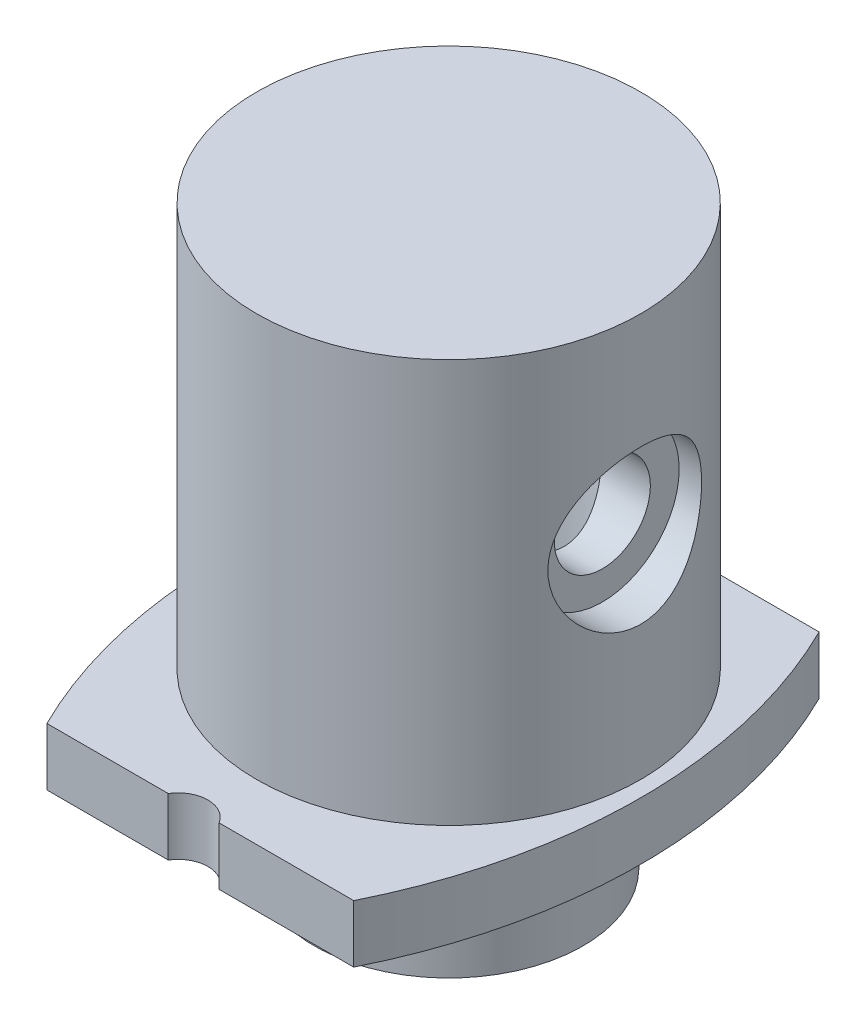
ISO-10303-21;
HEADER;
FILE_DESCRIPTION(('STEP AP214'),'2;1');
FILE_NAME('part.step','',(''),(''),'','','');
FILE_SCHEMA(('AUTOMOTIVE_DESIGN { 1 0 10303 214 1 1 1 1 }'));
ENDSEC;
DATA;
#1=APPLICATION_CONTEXT('core data for automotive mechanical design processes');
#2=APPLICATION_PROTOCOL_DEFINITION('international standard','automotive_design',2000,#1);
#3=PRODUCT_CONTEXT('',#1,'mechanical');
#4=PRODUCT('Part','Part','',(#3));
#5=PRODUCT_RELATED_PRODUCT_CATEGORY('part','',(#4));
#6=PRODUCT_DEFINITION_FORMATION('','',#4);
#7=PRODUCT_DEFINITION_CONTEXT('part definition',#1,'design');
#8=PRODUCT_DEFINITION('design','',#6,#7);
#9=PRODUCT_DEFINITION_SHAPE('','',#8);
#10=(LENGTH_UNIT() NAMED_UNIT(*) SI_UNIT(.MILLI.,.METRE.));
#11=(NAMED_UNIT(*) PLANE_ANGLE_UNIT() SI_UNIT($,.RADIAN.));
#12=(NAMED_UNIT(*) SI_UNIT($,.STERADIAN.) SOLID_ANGLE_UNIT());
#13=UNCERTAINTY_MEASURE_WITH_UNIT(LENGTH_MEASURE(1.E-05),#10,'distance_accuracy_value','');
#14=(GEOMETRIC_REPRESENTATION_CONTEXT(3) GLOBAL_UNCERTAINTY_ASSIGNED_CONTEXT((#13)) GLOBAL_UNIT_ASSIGNED_CONTEXT((#10,
#11,#12)) REPRESENTATION_CONTEXT('',''));
#15=CARTESIAN_POINT('',(0.,0.,0.));
#16=DIRECTION('',(0.,0.,1.));
#17=DIRECTION('',(1.,0.,0.));
#18=AXIS2_PLACEMENT_3D('',#15,#16,#17);
#19=CARTESIAN_POINT('',(-7.98578744171232,-3.,12.9281560249964));
#20=DIRECTION('',(0.,0.,1.));
#21=DIRECTION('',(1.,0.,0.));
#22=AXIS2_PLACEMENT_3D('',#19,#20,#21);
#23=PLANE('',#22);
#24=DIRECTION('',(0.,1.,0.));
#25=VECTOR('',#24,1.);
#26=CARTESIAN_POINT('',(0.976511748965211,-9.,12.9281560249964));
#27=LINE('',#26,#25);
#28=CARTESIAN_POINT('',(0.976511748965211,-3.,12.9281560249964));
#29=VERTEX_POINT('',#28);
#30=CARTESIAN_POINT('',(0.976511748965211,0.,12.9281560249964));
#31=VERTEX_POINT('',#30);
#32=EDGE_CURVE('E55',#29,#31,#27,.T.);
#33=ORIENTED_EDGE('',*,*,#32,.F.);
#34=DIRECTION('',(1.,0.,0.));
#35=VECTOR('',#34,1.);
#36=CARTESIAN_POINT('',(-7.98578744171232,-3.,12.9281560249964));
#37=LINE('',#36,#35);
#38=CARTESIAN_POINT('',(7.98578744171232,-3.,12.9281560249964));
#39=VERTEX_POINT('',#38);
#40=EDGE_CURVE('E326',#29,#39,#37,.T.);
#41=ORIENTED_EDGE('',*,*,#40,.T.);
#42=DIRECTION('',(0.,1.,0.));
#43=VECTOR('',#42,1.);
#44=CARTESIAN_POINT('',(7.98578744171232,-3.,12.9281560249964));
#45=LINE('',#44,#43);
#46=CARTESIAN_POINT('',(7.98578744171232,0.,12.9281560249964));
#47=VERTEX_POINT('',#46);
#48=EDGE_CURVE('E125',#39,#47,#45,.T.);
#49=ORIENTED_EDGE('',*,*,#48,.T.);
#50=DIRECTION('',(1.,0.,0.));
#51=VECTOR('',#50,1.);
#52=CARTESIAN_POINT('',(-7.98578744171232,0.,12.9281560249964));
#53=LINE('',#52,#51);
#54=EDGE_CURVE('E117',#31,#47,#53,.T.);
#55=ORIENTED_EDGE('',*,*,#54,.F.);
#56=EDGE_LOOP('',(#33,#41,#49,#55));
#57=FACE_BOUND('',#56,.T.);
#58=ADVANCED_FACE('F35',(#57),#23,.T.);
#59=CARTESIAN_POINT('',(0.,21.,0.));
#60=DIRECTION('',(0.,-1.,0.));
#61=DIRECTION('',(0.,0.,-1.));
#62=AXIS2_PLACEMENT_3D('',#59,#60,#61);
#63=CYLINDRICAL_SURFACE('',#62,10.);
#64=CARTESIAN_POINT('',(9.16515138991168,11.,-4.));
#65=CARTESIAN_POINT('',(9.16515220722506,10.8928225032156,-3.99999917996685));
#66=CARTESIAN_POINT('',(9.16703782704588,10.7856121402052,-3.99568627578832));
#67=CARTESIAN_POINT('',(9.17451890581268,10.5719679058293,-3.97847804504315));
#68=CARTESIAN_POINT('',(9.18011663538446,10.4655345500547,-3.965577465543));
#69=CARTESIAN_POINT('',(9.19485078616074,10.2540640466445,-3.9312935770878));
#70=CARTESIAN_POINT('',(9.20399425848326,10.1490301151513,-3.90989336356571));
#71=CARTESIAN_POINT('',(9.2255144619826,9.94131240281023,-3.85883937208579));
#72=CARTESIAN_POINT('',(9.23789253541712,9.83862961689824,-3.82918216740128));
#73=CARTESIAN_POINT('',(9.27920231487636,9.53601027337141,-3.72849978450445));
#74=CARTESIAN_POINT('',(9.31238810193525,9.34046207903567,-3.64559228099563));
#75=CARTESIAN_POINT('',(9.38629512671437,8.96619873132704,-3.45083256453888));
#76=CARTESIAN_POINT('',(9.42701471853534,8.78747991410875,-3.33898667159604));
#77=CARTESIAN_POINT('',(9.51401677460927,8.44148818639859,-3.08264624953203));
#78=CARTESIAN_POINT('',(9.56047821792022,8.27528956671102,-2.93675933272146));
#79=CARTESIAN_POINT('',(9.65224928088018,7.96893959195808,-2.61941759406606));
#80=CARTESIAN_POINT('',(9.69755849326326,7.82879733924504,-2.44795387495429));
#81=CARTESIAN_POINT('',(9.78406811808174,7.5731878901629,-2.07601279575004));
#82=CARTESIAN_POINT('',(9.82503606295846,7.45891158003059,-1.87465797803874));
#83=CARTESIAN_POINT('',(9.89607856333948,7.26631268032305,-1.45365059895514));
#84=CARTESIAN_POINT('',(9.92615755049622,7.18797546056676,-1.23400552632834));
#85=CARTESIAN_POINT('',(9.97076649749865,7.07331707267703,-0.793932865332428));
#86=CARTESIAN_POINT('',(9.98597873479395,7.03514538400194,-0.574057972725523));
#87=CARTESIAN_POINT('',(10.001606214367,6.99594301649917,-0.130532654160157));
#88=CARTESIAN_POINT('',(10.0020269755724,6.99489848495549,0.0931163324631206));
#89=CARTESIAN_POINT('',(9.98843925626005,7.02896554254645,0.524464988663932));
#90=CARTESIAN_POINT('',(9.9752399353889,7.06204954629711,0.732354905542457));
#91=CARTESIAN_POINT('',(9.93698582942363,7.1599857518182,1.1393462186423));
#92=CARTESIAN_POINT('',(9.91193017443785,7.22484028458435,1.33844696883604));
#93=CARTESIAN_POINT('',(9.85193648913816,7.38527296597229,1.72579587696675));
#94=CARTESIAN_POINT('',(9.81685520932146,7.48129942968872,1.91383524674319));
#95=CARTESIAN_POINT('',(9.7402917036085,7.70093001378034,2.27161630149723));
#96=CARTESIAN_POINT('',(9.69880728534381,7.82454358618434,2.44135168543995));
#97=CARTESIAN_POINT('',(9.61043274352157,8.1052982719048,2.76953765597606));
#98=CARTESIAN_POINT('',(9.56336653023493,8.26410778515017,2.92651569053149));
#99=CARTESIAN_POINT('',(9.4712332194655,8.60598114365943,3.21221483078645));
#100=CARTESIAN_POINT('',(9.42616678016159,8.78905289638997,3.34092668757428));
#101=CARTESIAN_POINT('',(9.3419379481804,9.18083804474915,3.56980837743822));
#102=CARTESIAN_POINT('',(9.30297828115414,9.39012966067764,3.66906930327244));
#103=CARTESIAN_POINT('',(9.23775180688171,9.8244309806241,3.83035251973301));
#104=CARTESIAN_POINT('',(9.21147675782622,10.0494303694531,3.89239899675599));
#105=CARTESIAN_POINT('',(9.17659519405432,10.4940715549349,3.97390989770977));
#106=CARTESIAN_POINT('',(9.16700732912276,10.7132008942571,3.99574419362908));
#107=CARTESIAN_POINT('',(9.16378995738077,11.1521544155191,4.00312265288578));
#108=CARTESIAN_POINT('',(9.17015561120724,11.3719783665513,3.98867782118257));
#109=CARTESIAN_POINT('',(9.19712088718227,11.7929178699139,3.92606578958006));
#110=CARTESIAN_POINT('',(9.21688915596603,11.9943858748,3.87986612404771));
#111=CARTESIAN_POINT('',(9.26740102054679,12.386576809571,3.75760837382175));
#112=CARTESIAN_POINT('',(9.29814704977195,12.5772973462148,3.68154366860459));
#113=CARTESIAN_POINT('',(9.36867563720203,12.9512047155908,3.49827127896311));
#114=CARTESIAN_POINT('',(9.40877409278357,13.1337723773872,3.38992573652914));
#115=CARTESIAN_POINT('',(9.49300770315588,13.478965974885,3.14633044888379));
#116=CARTESIAN_POINT('',(9.5371444979208,13.6415837455978,3.01106974696435));
#117=CARTESIAN_POINT('',(9.62841831942843,13.9547468171913,2.70568842336055));
#118=CARTESIAN_POINT('',(9.67553614570507,14.1035131305545,2.53373085888854));
#119=CARTESIAN_POINT('',(9.76439589135024,14.3703541532482,2.16616726673934));
#120=CARTESIAN_POINT('',(9.80613759186121,14.4884276132975,1.97056027694192));
#121=CARTESIAN_POINT('',(9.87967431800929,14.6900952528195,1.56055986799732));
#122=CARTESIAN_POINT('',(9.9114717248188,14.7736976879472,1.346170961965));
#123=CARTESIAN_POINT('',(9.96145426937248,14.9030977051994,0.904787181861566));
#124=CARTESIAN_POINT('',(9.97964679410119,14.9489158043134,0.677799220674797));
#125=CARTESIAN_POINT('',(9.99958016425668,14.999009401911,0.233633020611974));
#126=CARTESIAN_POINT('',(10.0023169350655,15.0058002520768,0.0167809848943045));
#127=CARTESIAN_POINT('',(9.99372084740381,14.9842890462796,-0.414867671174724));
#128=CARTESIAN_POINT('',(9.98239011871255,14.955992302479,-0.62966459770289));
#129=CARTESIAN_POINT('',(9.94743026789157,14.8669064057872,-1.04434180494581));
#130=CARTESIAN_POINT('',(9.92418961491739,14.8071420434949,-1.2444776131699));
#131=CARTESIAN_POINT('',(9.86789895440956,14.6578944552422,-1.63184470564404));
#132=CARTESIAN_POINT('',(9.83484713776136,14.568405747944,-1.81907360209111));
#133=CARTESIAN_POINT('',(9.76036189588764,14.3577933524316,-2.18440609879393));
#134=CARTESIAN_POINT('',(9.71862262764551,14.2354464559039,-2.3617408310488));
#135=CARTESIAN_POINT('',(9.63178803063432,13.9644239163639,-2.69410799958838));
#136=CARTESIAN_POINT('',(9.58669131729773,13.8157373759609,-2.849131156699));
#137=CARTESIAN_POINT('',(9.49475540255923,13.4853657611342,-3.14240275826141));
#138=CARTESIAN_POINT('',(9.4479811565371,13.302207701298,-3.27901865020172));
#139=CARTESIAN_POINT('',(9.36099292501489,12.9141302787523,-3.51969402497221));
#140=CARTESIAN_POINT('',(9.32077971107738,12.7092083613338,-3.62374968011082));
#141=CARTESIAN_POINT('',(9.25517900642369,12.3018760562204,-3.78798515690828));
#142=CARTESIAN_POINT('',(9.22878451494603,12.1008923240541,-3.85126569346865));
#143=CARTESIAN_POINT('',(9.1988556584339,11.7933610402093,-3.92194632104984));
#144=CARTESIAN_POINT('',(9.19049270633767,11.6899269641056,-3.94146052144918));
#145=CARTESIAN_POINT('',(9.17721200341611,11.4816430703891,-3.97228850679684));
#146=CARTESIAN_POINT('',(9.17229225293171,11.3767941106041,-3.98360705155155));
#147=CARTESIAN_POINT('',(9.16783675423417,11.2264494086476,-3.99384232103283));
#148=CARTESIAN_POINT('',(9.16683059815414,11.1812001696778,-3.99615058414993));
#149=CARTESIAN_POINT('',(9.16548771864777,11.0906359157854,-3.99922965337524));
#150=CARTESIAN_POINT('',(9.16515104430392,11.0453208962838,-4.00000034675784));
#151=CARTESIAN_POINT('',(9.16515138991168,11.,-4.));
#152=B_SPLINE_CURVE_WITH_KNOTS('',3,(#64,#65,#66,#67,#68,#69,#70,#71,#72,#73,#74,#75,#76,#77,
#78,#79,#80,#81,#82,#83,#84,#85,#86,#87,#88,#89,#90,#91,#92,#93,#94,#95,#96,#97,#98,#99,#100,
#101,#102,#103,#104,#105,#106,#107,#108,#109,#110,#111,#112,#113,#114,#115,#116,#117,#118,#119,
#120,#121,#122,#123,#124,#125,#126,#127,#128,#129,#130,#131,#132,#133,#134,#135,#136,#137,#138,
#139,#140,#141,#142,#143,#144,#145,#146,#147,#148,#149,#150,#151),.UNSPECIFIED.,.T.,.F.,(4,2,2,
2,2,2,2,2,2,2,2,2,2,2,2,2,2,2,2,2,2,2,2,2,2,2,2,2,2,2,2,2,2,2,2,2,2,2,2,2,2,2,2,4),(0.,
0.321486083338406,0.643168995111192,0.965494918272706,1.28795480954363,1.92974178448593,
2.57138871437637,3.24631250358764,3.92147162486599,4.62325351972771,5.32474947728875,
5.99228379564281,6.65956904401258,7.28937303450519,7.91922324048033,8.5585661425971,
9.19812843669977,9.87968101952626,10.5614562804417,11.2624893122443,11.9630662339012,
12.6208430883875,13.2784204360579,13.898545099602,14.5188073109319,15.1642232309532,
15.8099024284161,16.5032748228387,17.1966754349541,17.8899098841554,18.5827676569819,
19.2304209330182,19.8779761681512,20.5056400267662,21.1334196944708,21.7889411606976,
22.4447344691833,23.1411252036114,23.8375977730829,24.4715333542807,24.7879924179096,
25.1042675432749,25.240200643082,25.3761437083411),.UNSPECIFIED.);
#153=CARTESIAN_POINT('',(9.16515138991168,11.,-4.));
#154=VERTEX_POINT('',#153);
#155=EDGE_CURVE('E11',#154,#154,#152,.T.);
#156=ORIENTED_EDGE('',*,*,#155,.T.);
#157=EDGE_LOOP('',(#156));
#158=FACE_BOUND('',#157,.T.);
#159=CARTESIAN_POINT('',(0.,21.,0.));
#160=DIRECTION('',(0.,1.,0.));
#161=DIRECTION('',(0.,0.,1.));
#162=AXIS2_PLACEMENT_3D('',#159,#160,#161);
#163=CIRCLE('',#162,10.);
#164=CARTESIAN_POINT('',(0.,21.,10.));
#165=VERTEX_POINT('',#164);
#166=EDGE_CURVE('E133',#165,#165,#163,.T.);
#167=ORIENTED_EDGE('',*,*,#166,.F.);
#168=EDGE_LOOP('',(#167));
#169=FACE_BOUND('',#168,.T.);
#170=CARTESIAN_POINT('',(0.,0.,0.));
#171=DIRECTION('',(0.,1.,0.));
#172=DIRECTION('',(0.,0.,1.));
#173=AXIS2_PLACEMENT_3D('',#170,#171,#172);
#174=CIRCLE('',#173,10.);
#175=CARTESIAN_POINT('',(0.,0.,10.));
#176=VERTEX_POINT('',#175);
#177=EDGE_CURVE('E132',#176,#176,#174,.T.);
#178=ORIENTED_EDGE('',*,*,#177,.T.);
#179=EDGE_LOOP('',(#178));
#180=FACE_BOUND('',#179,.T.);
#181=ADVANCED_FACE('F37',(#158,#169,#180),#63,.T.);
#182=CARTESIAN_POINT('',(0.,21.,0.));
#183=DIRECTION('',(0.,1.,0.));
#184=DIRECTION('',(0.,0.,1.));
#185=AXIS2_PLACEMENT_3D('',#182,#183,#184);
#186=PLANE('',#185);
#187=ORIENTED_EDGE('',*,*,#166,.T.);
#188=EDGE_LOOP('',(#187));
#189=FACE_BOUND('',#188,.T.);
#190=ADVANCED_FACE('F158',(#189),#186,.T.);
#191=CARTESIAN_POINT('',(16.4464215619963,-3.,0.815257434102531));
#192=DIRECTION('',(0.,1.,0.));
#193=DIRECTION('',(0.,0.,1.));
#194=AXIS2_PLACEMENT_3D('',#191,#192,#193);
#195=CYLINDRICAL_SURFACE('',#194,27.2700412371191);
#196=CARTESIAN_POINT('',(16.4464215619963,0.,0.815257434102531));
#197=DIRECTION('',(0.,-1.,0.));
#198=DIRECTION('',(0.,0.,-1.));
#199=AXIS2_PLACEMENT_3D('',#196,#197,#198);
#200=CIRCLE('',#199,27.2700412371191);
#201=CARTESIAN_POINT('',(-7.98578744171232,0.,12.9281560249964));
#202=VERTEX_POINT('',#201);
#203=CARTESIAN_POINT('',(-7.98578744171232,0.,-11.2976411567914));
#204=VERTEX_POINT('',#203);
#205=EDGE_CURVE('E115',#202,#204,#200,.T.);
#206=ORIENTED_EDGE('',*,*,#205,.T.);
#207=DIRECTION('',(0.,1.,0.));
#208=VECTOR('',#207,1.);
#209=CARTESIAN_POINT('',(-7.98578744171232,-3.,-11.2976411567914));
#210=LINE('',#209,#208);
#211=CARTESIAN_POINT('',(-7.98578744171232,-3.,-11.2976411567914));
#212=VERTEX_POINT('',#211);
#213=EDGE_CURVE('E130',#212,#204,#210,.T.);
#214=ORIENTED_EDGE('',*,*,#213,.F.);
#215=CARTESIAN_POINT('',(16.4464215619963,-3.,0.815257434102531));
#216=DIRECTION('',(0.,-1.,0.));
#217=DIRECTION('',(0.,0.,-1.));
#218=AXIS2_PLACEMENT_3D('',#215,#216,#217);
#219=CIRCLE('',#218,27.2700412371191);
#220=CARTESIAN_POINT('',(-7.98578744171232,-3.,12.9281560249964));
#221=VERTEX_POINT('',#220);
#222=EDGE_CURVE('E116',#221,#212,#219,.T.);
#223=ORIENTED_EDGE('',*,*,#222,.F.);
#224=DIRECTION('',(0.,1.,0.));
#225=VECTOR('',#224,1.);
#226=CARTESIAN_POINT('',(-7.98578744171232,-3.,12.9281560249964));
#227=LINE('',#226,#225);
#228=EDGE_CURVE('E64',#221,#202,#227,.T.);
#229=ORIENTED_EDGE('',*,*,#228,.T.);
#230=EDGE_LOOP('',(#206,#214,#223,#229));
#231=FACE_BOUND('',#230,.T.);
#232=ADVANCED_FACE('F171',(#231),#195,.T.);
#233=CARTESIAN_POINT('',(-7.98578744171232,-3.,-11.2976411567914));
#234=DIRECTION('',(0.,0.,1.));
#235=DIRECTION('',(1.,0.,0.));
#236=AXIS2_PLACEMENT_3D('',#233,#234,#235);
#237=PLANE('',#236);
#238=DIRECTION('',(1.,0.,0.));
#239=VECTOR('',#238,1.);
#240=CARTESIAN_POINT('',(-7.98578744171232,0.,-11.2976411567914));
#241=LINE('',#240,#239);
#242=CARTESIAN_POINT('',(7.98578744171232,0.,-11.2976411567914));
#243=VERTEX_POINT('',#242);
#244=EDGE_CURVE('E328',#204,#243,#241,.T.);
#245=ORIENTED_EDGE('',*,*,#244,.T.);
#246=DIRECTION('',(0.,1.,0.));
#247=VECTOR('',#246,1.);
#248=CARTESIAN_POINT('',(7.98578744171232,-3.,-11.2976411567914));
#249=LINE('',#248,#247);
#250=CARTESIAN_POINT('',(7.98578744171232,-3.,-11.2976411567914));
#251=VERTEX_POINT('',#250);
#252=EDGE_CURVE('E128',#251,#243,#249,.T.);
#253=ORIENTED_EDGE('',*,*,#252,.F.);
#254=DIRECTION('',(1.,0.,0.));
#255=VECTOR('',#254,1.);
#256=CARTESIAN_POINT('',(-7.98578744171232,-3.,-11.2976411567914));
#257=LINE('',#256,#255);
#258=EDGE_CURVE('E91',#212,#251,#257,.T.);
#259=ORIENTED_EDGE('',*,*,#258,.F.);
#260=ORIENTED_EDGE('',*,*,#213,.T.);
#261=EDGE_LOOP('',(#245,#253,#259,#260));
#262=FACE_BOUND('',#261,.T.);
#263=ADVANCED_FACE('F166',(#262),#237,.F.);
#264=CARTESIAN_POINT('',(-16.4464215619963,-3.,0.815257434102531));
#265=DIRECTION('',(0.,1.,0.));
#266=DIRECTION('',(0.,0.,1.));
#267=AXIS2_PLACEMENT_3D('',#264,#265,#266);
#268=CYLINDRICAL_SURFACE('',#267,27.2700412371191);
#269=CARTESIAN_POINT('',(-16.4464215619963,0.,0.815257434102531));
#270=DIRECTION('',(0.,1.,0.));
#271=DIRECTION('',(0.,0.,1.));
#272=AXIS2_PLACEMENT_3D('',#269,#270,#271);
#273=CIRCLE('',#272,27.2700412371191);
#274=EDGE_CURVE('E120',#47,#243,#273,.T.);
#275=ORIENTED_EDGE('',*,*,#274,.F.);
#276=ORIENTED_EDGE('',*,*,#48,.F.);
#277=CARTESIAN_POINT('',(-16.4464215619963,-3.,0.815257434102531));
#278=DIRECTION('',(0.,1.,0.));
#279=DIRECTION('',(0.,0.,1.));
#280=AXIS2_PLACEMENT_3D('',#277,#278,#279);
#281=CIRCLE('',#280,27.2700412371191);
#282=EDGE_CURVE('E323',#39,#251,#281,.T.);
#283=ORIENTED_EDGE('',*,*,#282,.T.);
#284=ORIENTED_EDGE('',*,*,#252,.T.);
#285=EDGE_LOOP('',(#275,#276,#283,#284));
#286=FACE_BOUND('',#285,.T.);
#287=ADVANCED_FACE('F162',(#286),#268,.T.);
#288=DIRECTION('',(0.,1.,0.));
#289=VECTOR('',#288,1.);
#290=CARTESIAN_POINT('',(-1.66916251407089,-9.,12.9281560249964));
#291=LINE('',#290,#289);
#292=CARTESIAN_POINT('',(-1.66916251407089,0.,12.9281560249964));
#293=VERTEX_POINT('',#292);
#294=CARTESIAN_POINT('',(-1.66916251407089,-3.,12.9281560249964));
#295=VERTEX_POINT('',#294);
#296=EDGE_CURVE('E102',#293,#295,#291,.F.);
#297=ORIENTED_EDGE('',*,*,#296,.F.);
#298=EDGE_CURVE('E110',#202,#293,#53,.T.);
#299=ORIENTED_EDGE('',*,*,#298,.F.);
#300=ORIENTED_EDGE('',*,*,#228,.F.);
#301=EDGE_CURVE('E112',#221,#295,#37,.T.);
#302=ORIENTED_EDGE('',*,*,#301,.T.);
#303=EDGE_LOOP('',(#297,#299,#300,#302));
#304=FACE_BOUND('',#303,.T.);
#305=ADVANCED_FACE('F109',(#304),#23,.T.);
#306=CARTESIAN_POINT('',(16.4464215619963,-3.,0.815257434102531));
#307=DIRECTION('',(0.,-1.,0.));
#308=DIRECTION('',(0.,0.,-1.));
#309=AXIS2_PLACEMENT_3D('',#306,#307,#308);
#310=PLANE('',#309);
#311=CARTESIAN_POINT('',(-0.346325382552838,-3.,13.7359938326516));
#312=DIRECTION('',(0.,-1.,0.));
#313=DIRECTION('',(0.,0.,-1.));
#314=AXIS2_PLACEMENT_3D('',#311,#312,#313);
#315=CIRCLE('',#314,1.55);
#316=EDGE_CURVE('E107',#295,#29,#315,.T.);
#317=ORIENTED_EDGE('',*,*,#316,.F.);
#318=ORIENTED_EDGE('',*,*,#301,.F.);
#319=ORIENTED_EDGE('',*,*,#222,.T.);
#320=ORIENTED_EDGE('',*,*,#258,.T.);
#321=ORIENTED_EDGE('',*,*,#282,.F.);
#322=ORIENTED_EDGE('',*,*,#40,.F.);
#323=EDGE_LOOP('',(#317,#318,#319,#320,#321,#322));
#324=FACE_BOUND('',#323,.T.);
#325=CARTESIAN_POINT('',(0.,-3.,0.));
#326=DIRECTION('',(0.,-1.,0.));
#327=DIRECTION('',(0.,0.,-1.));
#328=AXIS2_PLACEMENT_3D('',#325,#326,#327);
#329=CIRCLE('',#328,7.);
#330=CARTESIAN_POINT('',(0.,-3.,-7.));
#331=VERTEX_POINT('',#330);
#332=EDGE_CURVE('E48',#331,#331,#329,.T.);
#333=ORIENTED_EDGE('',*,*,#332,.F.);
#334=EDGE_LOOP('',(#333));
#335=FACE_BOUND('',#334,.T.);
#336=ADVANCED_FACE('F141',(#324,#335),#310,.T.);
#337=CARTESIAN_POINT('',(16.4464215619963,0.,0.815257434102531));
#338=DIRECTION('',(0.,-1.,0.));
#339=DIRECTION('',(0.,0.,-1.));
#340=AXIS2_PLACEMENT_3D('',#337,#338,#339);
#341=PLANE('',#340);
#342=ORIENTED_EDGE('',*,*,#177,.F.);
#343=EDGE_LOOP('',(#342));
#344=FACE_BOUND('',#343,.T.);
#345=ORIENTED_EDGE('',*,*,#298,.T.);
#346=CARTESIAN_POINT('',(-0.346325382552838,0.,13.7359938326516));
#347=DIRECTION('',(0.,1.,0.));
#348=DIRECTION('',(0.,0.,1.));
#349=AXIS2_PLACEMENT_3D('',#346,#347,#348);
#350=CIRCLE('',#349,1.55);
#351=EDGE_CURVE('E99',#31,#293,#350,.T.);
#352=ORIENTED_EDGE('',*,*,#351,.F.);
#353=ORIENTED_EDGE('',*,*,#54,.T.);
#354=ORIENTED_EDGE('',*,*,#274,.T.);
#355=ORIENTED_EDGE('',*,*,#244,.F.);
#356=ORIENTED_EDGE('',*,*,#205,.F.);
#357=EDGE_LOOP('',(#345,#352,#353,#354,#355,#356));
#358=FACE_BOUND('',#357,.T.);
#359=ADVANCED_FACE('F114',(#344,#358),#341,.F.);
#360=CARTESIAN_POINT('',(0.,-9.,0.));
#361=DIRECTION('',(0.,1.,0.));
#362=DIRECTION('',(0.,0.,1.));
#363=AXIS2_PLACEMENT_3D('',#360,#361,#362);
#364=CYLINDRICAL_SURFACE('',#363,7.);
#365=CARTESIAN_POINT('',(0.,-9.,0.));
#366=DIRECTION('',(0.,-1.,0.));
#367=DIRECTION('',(0.,0.,-1.));
#368=AXIS2_PLACEMENT_3D('',#365,#366,#367);
#369=CIRCLE('',#368,7.);
#370=CARTESIAN_POINT('',(0.,-9.,-7.));
#371=VERTEX_POINT('',#370);
#372=EDGE_CURVE('E315',#371,#371,#369,.T.);
#373=ORIENTED_EDGE('',*,*,#372,.F.);
#374=EDGE_LOOP('',(#373));
#375=FACE_BOUND('',#374,.T.);
#376=ORIENTED_EDGE('',*,*,#332,.T.);
#377=EDGE_LOOP('',(#376));
#378=FACE_BOUND('',#377,.T.);
#379=ADVANCED_FACE('F140',(#375,#378),#364,.T.);
#380=CARTESIAN_POINT('',(0.,-9.,0.));
#381=DIRECTION('',(0.,-1.,0.));
#382=DIRECTION('',(0.,0.,-1.));
#383=AXIS2_PLACEMENT_3D('',#380,#381,#382);
#384=PLANE('',#383);
#385=CARTESIAN_POINT('',(0.,-9.,0.));
#386=DIRECTION('',(0.,-1.,0.));
#387=DIRECTION('',(0.,0.,-1.));
#388=AXIS2_PLACEMENT_3D('',#385,#386,#387);
#389=CIRCLE('',#388,6.);
#390=CARTESIAN_POINT('',(0.,-9.,-6.));
#391=VERTEX_POINT('',#390);
#392=EDGE_CURVE('E311',#391,#391,#389,.T.);
#393=ORIENTED_EDGE('',*,*,#392,.F.);
#394=EDGE_LOOP('',(#393));
#395=FACE_BOUND('',#394,.T.);
#396=ORIENTED_EDGE('',*,*,#372,.T.);
#397=EDGE_LOOP('',(#396));
#398=FACE_BOUND('',#397,.T.);
#399=ADVANCED_FACE('F147',(#395,#398),#384,.T.);
#400=CARTESIAN_POINT('',(0.,16.,0.));
#401=DIRECTION('',(0.,-1.,0.));
#402=DIRECTION('',(0.,0.,-1.));
#403=AXIS2_PLACEMENT_3D('',#400,#401,#402);
#404=CYLINDRICAL_SURFACE('',#403,6.);
#405=CARTESIAN_POINT('',(5.45435605731786,11.,-2.5));
#406=CARTESIAN_POINT('',(5.45435734054166,10.9332918168451,-2.49999850025921));
#407=CARTESIAN_POINT('',(5.4555854329,10.8665652078315,-2.49732449538893));
#408=CARTESIAN_POINT('',(5.460451257595,10.733613521597,-2.48666416485593));
#409=CARTESIAN_POINT('',(5.46409042196574,10.6673887661049,-2.47867468210215));
#410=CARTESIAN_POINT('',(5.47848490817198,10.4699481332294,-2.44679265931592));
#411=CARTESIAN_POINT('',(5.49271671920563,10.3401631835705,-2.41498683408238));
#412=CARTESIAN_POINT('',(5.52853615769555,10.0888452358687,-2.33180001337599));
#413=CARTESIAN_POINT('',(5.55009376241033,9.96728094790839,-2.28049881438598));
#414=CARTESIAN_POINT('',(5.59808356001864,9.73448982344301,-2.16001268934738));
#415=CARTESIAN_POINT('',(5.62451459938574,9.62326055002321,-2.09083199376537));
#416=CARTESIAN_POINT('',(5.68111508149861,9.40734601791058,-1.93194778443699));
#417=CARTESIAN_POINT('',(5.71141131571832,9.30338420295253,-1.84130648149063));
#418=CARTESIAN_POINT('',(5.77128595332676,9.11160023482553,-1.64404334636732));
#419=CARTESIAN_POINT('',(5.80086407614999,9.02378430448885,-1.53741538134828));
#420=CARTESIAN_POINT('',(5.8575107455344,8.86310074447136,-1.30552678905513));
#421=CARTESIAN_POINT('',(5.88441479600862,8.79104669211854,-1.17965858775786));
#422=CARTESIAN_POINT('',(5.93113040336416,8.66944801078251,-0.916264044334339));
#423=CARTESIAN_POINT('',(5.95094510785638,8.61989338960258,-0.778742909642265));
#424=CARTESIAN_POINT('',(5.98035041998162,8.54732106965964,-0.503536996147008));
#425=CARTESIAN_POINT('',(5.99041942231785,8.52305660676678,-0.36623315241801));
#426=CARTESIAN_POINT('',(6.00093657245546,8.49772472110802,-0.0891583607041747));
#427=CARTESIAN_POINT('',(6.00138862268061,8.49664788912577,0.050611563535765));
#428=CARTESIAN_POINT('',(5.99290258260449,8.51706856102921,0.319585560218812));
#429=CARTESIAN_POINT('',(5.98453429295767,8.53719620082688,0.448914977212892));
#430=CARTESIAN_POINT('',(5.96013033502178,8.59710620550091,0.702165787864646));
#431=CARTESIAN_POINT('',(5.94409410149732,8.63689001932115,0.826086782110447));
#432=CARTESIAN_POINT('',(5.90559704827471,8.73545608172753,1.06727623615443));
#433=CARTESIAN_POINT('',(5.88304194251414,8.79451892572424,1.18441435414909));
#434=CARTESIAN_POINT('',(5.83371427980366,8.92969151341809,1.40742353456466));
#435=CARTESIAN_POINT('',(5.80694023334947,9.00580728169785,1.51329059551623));
#436=CARTESIAN_POINT('',(5.74963397551513,9.17916484080079,1.7186818234134));
#437=CARTESIAN_POINT('',(5.71896988702082,9.27751758254304,1.81723287462318));
#438=CARTESIAN_POINT('',(5.65875721372882,9.48942288142814,1.99686282986464));
#439=CARTESIAN_POINT('',(5.62920906299901,9.60298127663566,2.0779349916834));
#440=CARTESIAN_POINT('',(5.57363224672088,9.84679007327971,2.22280378497074));
#441=CARTESIAN_POINT('',(5.54775116967603,9.97746641130549,2.28594506698397));
#442=CARTESIAN_POINT('',(5.50419688296718,10.2489620897626,2.38892864103959));
#443=CARTESIAN_POINT('',(5.48651780631503,10.3897740964842,2.42878759251238));
#444=CARTESIAN_POINT('',(5.46282425074792,10.667793617867,2.48160050339178));
#445=CARTESIAN_POINT('',(5.45612738403682,10.8046422445285,2.49613229266517));
#446=CARTESIAN_POINT('',(5.45320573611839,11.0789569648126,2.50251261037213));
#447=CARTESIAN_POINT('',(5.45697733196184,11.2164228283807,2.49436898636095));
#448=CARTESIAN_POINT('',(5.47386262693795,11.4787967708634,2.45706955131303));
#449=CARTESIAN_POINT('',(5.48636276033852,11.6039453735742,2.42929237636148));
#450=CARTESIAN_POINT('',(5.51851260594277,11.8477025929951,2.355341171284));
#451=CARTESIAN_POINT('',(5.53816398920152,11.9663096736616,2.30916284106238));
#452=CARTESIAN_POINT('',(5.58341595714177,12.1992306207128,2.19755041610386));
#453=CARTESIAN_POINT('',(5.60923324404617,12.3131499492194,2.13138366612393));
#454=CARTESIAN_POINT('',(5.66360007481535,12.5288161049993,1.98240156877197));
#455=CARTESIAN_POINT('',(5.69215079841133,12.6305576334087,1.89957901575222));
#456=CARTESIAN_POINT('',(5.75157239569101,12.8276002697626,1.71168891143074));
#457=CARTESIAN_POINT('',(5.78244293417774,12.9217027998803,1.6053593229584));
#458=CARTESIAN_POINT('',(5.84086722367755,13.0909445839796,1.37770302510816));
#459=CARTESIAN_POINT('',(5.868420731537,13.1660824482059,1.25637521761135));
#460=CARTESIAN_POINT('',(5.91728503171628,13.2951797508084,1.00130936160273));
#461=CARTESIAN_POINT('',(5.93857966278875,13.3490844822848,0.867540339261896));
#462=CARTESIAN_POINT('',(5.9723634620551,13.4332335849628,0.591717670323946));
#463=CARTESIAN_POINT('',(5.98485787035282,13.463492037549,0.449669008506775));
#464=CARTESIAN_POINT('',(5.9990306959926,13.4977162500204,0.172033066960383));
#465=CARTESIAN_POINT('',(6.0014040908376,13.5033719957101,0.036688169398434));
#466=CARTESIAN_POINT('',(5.99699046946599,13.4927737210953,-0.232973623239238));
#467=CARTESIAN_POINT('',(5.99020505911644,13.476523541686,-0.367290694377477));
#468=CARTESIAN_POINT('',(5.9686013201843,13.4237878424573,-0.626172965578197));
#469=CARTESIAN_POINT('',(5.95407648620171,13.3880405905242,-0.750915078182086));
#470=CARTESIAN_POINT('',(5.91858999492374,13.2981315541276,-0.992584458507238));
#471=CARTESIAN_POINT('',(5.89762711496349,13.2439662716418,-1.1095102366691));
#472=CARTESIAN_POINT('',(5.85011651583377,13.1160207524208,-1.33804914068053));
#473=CARTESIAN_POINT('',(5.82335921372399,13.041464676487,-1.44918335299799));
#474=CARTESIAN_POINT('',(5.7674312075248,12.8759863551893,-1.65783731421916));
#475=CARTESIAN_POINT('',(5.73825960968076,12.7850580341639,-1.75535198504112));
#476=CARTESIAN_POINT('',(5.67829702479813,12.5821074699279,-1.9408997224229));
#477=CARTESIAN_POINT('',(5.64753091772368,12.46907088797,-2.02783607699356));
#478=CARTESIAN_POINT('',(5.5899105903639,12.2290936079993,-2.18166607575475));
#479=CARTESIAN_POINT('',(5.56305856115973,12.1021451913326,-2.24854851583746));
#480=CARTESIAN_POINT('',(5.51685287460303,11.8380710666405,-2.35965744264203));
#481=CARTESIAN_POINT('',(5.49745949216625,11.7010040448504,-2.40400437258696));
#482=CARTESIAN_POINT('',(5.47594959049764,11.4908362309336,-2.45239925350778));
#483=CARTESIAN_POINT('',(5.47004503557757,11.4200894020439,-2.46550603347808));
#484=CARTESIAN_POINT('',(5.46095373466209,11.2775739435814,-2.48558130943928));
#485=CARTESIAN_POINT('',(5.45776506941946,11.2058060720774,-2.49255414024397));
#486=CARTESIAN_POINT('',(5.45490391727668,11.089288394361,-2.49880479670823));
#487=CARTESIAN_POINT('',(5.45435519844583,11.0446483243266,-2.50000100378859));
#488=CARTESIAN_POINT('',(5.45435605731786,11.,-2.5));
#489=B_SPLINE_CURVE_WITH_KNOTS('',3,(#405,#406,#407,#408,#409,#410,#411,#412,#413,#414,#415,
#416,#417,#418,#419,#420,#421,#422,#423,#424,#425,#426,#427,#428,#429,#430,#431,#432,#433,#434,
#435,#436,#437,#438,#439,#440,#441,#442,#443,#444,#445,#446,#447,#448,#449,#450,#451,#452,#453,
#454,#455,#456,#457,#458,#459,#460,#461,#462,#463,#464,#465,#466,#467,#468,#469,#470,#471,#472,
#473,#474,#475,#476,#477,#478,#479,#480,#481,#482,#483,#484,#485,#486,#487,#488),.UNSPECIFIED.,
.T.,.F.,(4,2,2,2,2,2,2,2,2,2,2,2,2,2,2,2,2,2,2,2,2,2,2,2,2,2,2,2,2,2,2,2,2,2,2,2,2,2,2,2,2,4),
(0.,0.200084575093047,0.400288095243581,0.801278994956904,1.20064597557677,1.59991854837275,
2.02172149988563,2.44368668047077,2.88395420283103,3.32402600677038,3.7411967908316,
4.15819828963116,4.54982147617441,4.94147353531023,5.33910096407387,5.73686909172223,
6.16267530816224,6.58864548009989,7.02861558463919,7.46827048625634,7.87940023747111,
8.29038772171394,8.6750626926688,9.05982760961556,9.46088720770835,9.86212068725427,
10.2960179260552,10.7299469521823,11.1649867904569,11.5997673642051,12.004157373226,
12.4084764873833,12.7984529720747,13.1885035639884,13.5961819279257,14.0040118923231,
14.4395932095167,14.8754174341574,15.3088871873109,15.5252058174741,15.7413714538654,
15.8752896716763),.UNSPECIFIED.);
#490=CARTESIAN_POINT('',(5.45435605731786,11.,-2.5));
#491=VERTEX_POINT('',#490);
#492=EDGE_CURVE('E298',#491,#491,#489,.T.);
#493=ORIENTED_EDGE('',*,*,#492,.F.);
#494=EDGE_LOOP('',(#493));
#495=FACE_BOUND('',#494,.T.);
#496=CARTESIAN_POINT('',(0.,16.,0.));
#497=DIRECTION('',(0.,-1.,0.));
#498=DIRECTION('',(0.,0.,-1.));
#499=AXIS2_PLACEMENT_3D('',#496,#497,#498);
#500=CIRCLE('',#499,6.);
#501=CARTESIAN_POINT('',(0.,16.,-6.));
#502=VERTEX_POINT('',#501);
#503=EDGE_CURVE('E312',#502,#502,#500,.T.);
#504=ORIENTED_EDGE('',*,*,#503,.F.);
#505=EDGE_LOOP('',(#504));
#506=FACE_BOUND('',#505,.T.);
#507=ORIENTED_EDGE('',*,*,#392,.T.);
#508=EDGE_LOOP('',(#507));
#509=FACE_BOUND('',#508,.T.);
#510=ADVANCED_FACE('F213',(#495,#506,#509),#404,.F.);
#511=CARTESIAN_POINT('',(0.,16.,0.));
#512=DIRECTION('',(0.,-1.,0.));
#513=DIRECTION('',(0.,0.,-1.));
#514=AXIS2_PLACEMENT_3D('',#511,#512,#513);
#515=PLANE('',#514);
#516=ORIENTED_EDGE('',*,*,#503,.T.);
#517=EDGE_LOOP('',(#516));
#518=FACE_BOUND('',#517,.T.);
#519=ADVANCED_FACE('F221',(#518),#515,.T.);
#520=CARTESIAN_POINT('',(8.,11.,0.));
#521=DIRECTION('',(1.,0.,0.));
#522=DIRECTION('',(0.,0.,-1.));
#523=AXIS2_PLACEMENT_3D('',#520,#521,#522);
#524=CYLINDRICAL_SURFACE('',#523,4.);
#525=CARTESIAN_POINT('',(8.,11.,0.));
#526=DIRECTION('',(1.,0.,0.));
#527=DIRECTION('',(0.,0.,-1.));
#528=AXIS2_PLACEMENT_3D('',#525,#526,#527);
#529=CIRCLE('',#528,4.);
#530=CARTESIAN_POINT('',(8.,11.,-4.));
#531=VERTEX_POINT('',#530);
#532=EDGE_CURVE('E305',#531,#531,#529,.T.);
#533=ORIENTED_EDGE('',*,*,#532,.F.);
#534=EDGE_LOOP('',(#533));
#535=FACE_BOUND('',#534,.T.);
#536=ORIENTED_EDGE('',*,*,#155,.F.);
#537=EDGE_LOOP('',(#536));
#538=FACE_BOUND('',#537,.T.);
#539=ADVANCED_FACE('F225',(#535,#538),#524,.F.);
#540=CARTESIAN_POINT('',(8.,11.,0.));
#541=DIRECTION('',(1.,0.,0.));
#542=DIRECTION('',(0.,0.,-1.));
#543=AXIS2_PLACEMENT_3D('',#540,#541,#542);
#544=PLANE('',#543);
#545=CARTESIAN_POINT('',(8.,11.,0.));
#546=DIRECTION('',(1.,0.,0.));
#547=DIRECTION('',(0.,0.,-1.));
#548=AXIS2_PLACEMENT_3D('',#545,#546,#547);
#549=CIRCLE('',#548,2.5);
#550=CARTESIAN_POINT('',(8.,11.,-2.5));
#551=VERTEX_POINT('',#550);
#552=EDGE_CURVE('E306',#551,#551,#549,.F.);
#553=ORIENTED_EDGE('',*,*,#552,.T.);
#554=EDGE_LOOP('',(#553));
#555=FACE_BOUND('',#554,.T.);
#556=ORIENTED_EDGE('',*,*,#532,.T.);
#557=EDGE_LOOP('',(#556));
#558=FACE_BOUND('',#557,.T.);
#559=ADVANCED_FACE('F240',(#555,#558),#544,.T.);
#560=CARTESIAN_POINT('',(-10.8246196751229,11.,0.));
#561=DIRECTION('',(1.,0.,0.));
#562=DIRECTION('',(0.,0.,-1.));
#563=AXIS2_PLACEMENT_3D('',#560,#561,#562);
#564=CYLINDRICAL_SURFACE('',#563,2.5);
#565=ORIENTED_EDGE('',*,*,#552,.F.);
#566=EDGE_LOOP('',(#565));
#567=FACE_BOUND('',#566,.T.);
#568=ORIENTED_EDGE('',*,*,#492,.T.);
#569=EDGE_LOOP('',(#568));
#570=FACE_BOUND('',#569,.T.);
#571=ADVANCED_FACE('F256',(#567,#570),#564,.F.);
#572=CARTESIAN_POINT('',(-0.346325382552838,-9.,13.7359938326516));
#573=DIRECTION('',(0.,1.,0.));
#574=DIRECTION('',(0.,0.,1.));
#575=AXIS2_PLACEMENT_3D('',#572,#573,#574);
#576=CYLINDRICAL_SURFACE('',#575,1.55);
#577=ORIENTED_EDGE('',*,*,#32,.T.);
#578=ORIENTED_EDGE('',*,*,#351,.T.);
#579=ORIENTED_EDGE('',*,*,#296,.T.);
#580=ORIENTED_EDGE('',*,*,#316,.T.);
#581=EDGE_LOOP('',(#577,#578,#579,#580));
#582=FACE_BOUND('',#581,.T.);
#583=ADVANCED_FACE('F101',(#582),#576,.F.);
#584=CLOSED_SHELL('',(#58,#181,#190,#232,#263,#287,#305,#336,#359,#379,#399,#510,#519,#539,#559,
#571,#583));
#585=MANIFOLD_SOLID_BREP('B2',#584);
#586=ADVANCED_BREP_SHAPE_REPRESENTATION('',(#18,#585),#14);
#587=SHAPE_DEFINITION_REPRESENTATION(#9,#586);
ENDSEC;
END-ISO-10303-21;
